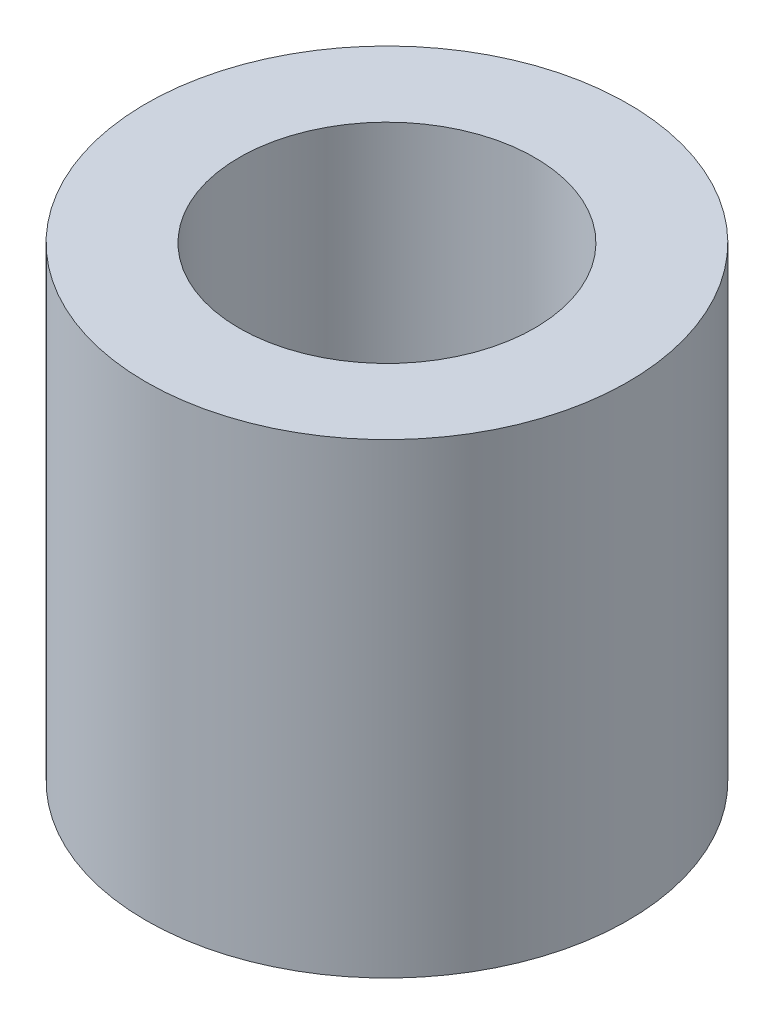
ISO-10303-21;
HEADER;
FILE_DESCRIPTION(('STEP AP214'),'2;1');
FILE_NAME('part.step','',(''),(''),'','','');
FILE_SCHEMA(('AUTOMOTIVE_DESIGN { 1 0 10303 214 1 1 1 1 }'));
ENDSEC;
DATA;
#1=APPLICATION_CONTEXT('core data for automotive mechanical design processes');
#2=APPLICATION_PROTOCOL_DEFINITION('international standard','automotive_design',2000,#1);
#3=PRODUCT_CONTEXT('',#1,'mechanical');
#4=PRODUCT('Part','Part','',(#3));
#5=PRODUCT_RELATED_PRODUCT_CATEGORY('part','',(#4));
#6=PRODUCT_DEFINITION_FORMATION('','',#4);
#7=PRODUCT_DEFINITION_CONTEXT('part definition',#1,'design');
#8=PRODUCT_DEFINITION('design','',#6,#7);
#9=PRODUCT_DEFINITION_SHAPE('','',#8);
#10=(LENGTH_UNIT() NAMED_UNIT(*) SI_UNIT(.MILLI.,.METRE.));
#11=(NAMED_UNIT(*) PLANE_ANGLE_UNIT() SI_UNIT($,.RADIAN.));
#12=(NAMED_UNIT(*) SI_UNIT($,.STERADIAN.) SOLID_ANGLE_UNIT());
#13=UNCERTAINTY_MEASURE_WITH_UNIT(LENGTH_MEASURE(1.E-05),#10,'distance_accuracy_value','');
#14=(GEOMETRIC_REPRESENTATION_CONTEXT(3) GLOBAL_UNCERTAINTY_ASSIGNED_CONTEXT((#13)) GLOBAL_UNIT_ASSIGNED_CONTEXT((#10,
#11,#12)) REPRESENTATION_CONTEXT('',''));
#15=CARTESIAN_POINT('',(0.,0.,0.));
#16=DIRECTION('',(0.,0.,1.));
#17=DIRECTION('',(1.,0.,0.));
#18=AXIS2_PLACEMENT_3D('',#15,#16,#17);
#19=CARTESIAN_POINT('',(0.,12.7,0.));
#20=DIRECTION('',(0.,1.,0.));
#21=DIRECTION('',(0.,0.,1.));
#22=AXIS2_PLACEMENT_3D('',#19,#20,#21);
#23=PLANE('',#22);
#24=CARTESIAN_POINT('',(0.,12.7,0.));
#25=DIRECTION('',(0.,1.,0.));
#26=DIRECTION('',(0.,0.,1.));
#27=AXIS2_PLACEMENT_3D('',#24,#25,#26);
#28=CIRCLE('',#27,6.565);
#29=CARTESIAN_POINT('',(0.,12.7,6.565));
#30=VERTEX_POINT('',#29);
#31=EDGE_CURVE('E10',#30,#30,#28,.T.);
#32=ORIENTED_EDGE('',*,*,#31,.T.);
#33=EDGE_LOOP('',(#32));
#34=FACE_BOUND('',#33,.T.);
#35=CARTESIAN_POINT('',(0.,12.7,0.));
#36=DIRECTION('',(0.,1.,0.));
#37=DIRECTION('',(0.,0.,1.));
#38=AXIS2_PLACEMENT_3D('',#35,#36,#37);
#39=CIRCLE('',#38,4.025);
#40=CARTESIAN_POINT('',(0.,12.7,4.025));
#41=VERTEX_POINT('',#40);
#42=EDGE_CURVE('E52',#41,#41,#39,.T.);
#43=ORIENTED_EDGE('',*,*,#42,.F.);
#44=EDGE_LOOP('',(#43));
#45=FACE_BOUND('',#44,.T.);
#46=ADVANCED_FACE('F41',(#34,#45),#23,.T.);
#47=CARTESIAN_POINT('',(0.,0.,0.));
#48=DIRECTION('',(0.,1.,0.));
#49=DIRECTION('',(0.,0.,1.));
#50=AXIS2_PLACEMENT_3D('',#47,#48,#49);
#51=PLANE('',#50);
#52=CARTESIAN_POINT('',(0.,0.,0.));
#53=DIRECTION('',(0.,1.,0.));
#54=DIRECTION('',(0.,0.,1.));
#55=AXIS2_PLACEMENT_3D('',#52,#53,#54);
#56=CIRCLE('',#55,6.565);
#57=CARTESIAN_POINT('',(0.,0.,6.565));
#58=VERTEX_POINT('',#57);
#59=EDGE_CURVE('E45',#58,#58,#56,.T.);
#60=ORIENTED_EDGE('',*,*,#59,.F.);
#61=EDGE_LOOP('',(#60));
#62=FACE_BOUND('',#61,.T.);
#63=CARTESIAN_POINT('',(0.,0.,0.));
#64=DIRECTION('',(0.,1.,0.));
#65=DIRECTION('',(0.,0.,1.));
#66=AXIS2_PLACEMENT_3D('',#63,#64,#65);
#67=CIRCLE('',#66,4.025);
#68=CARTESIAN_POINT('',(0.,0.,4.025));
#69=VERTEX_POINT('',#68);
#70=EDGE_CURVE('E54',#69,#69,#67,.T.);
#71=ORIENTED_EDGE('',*,*,#70,.T.);
#72=EDGE_LOOP('',(#71));
#73=FACE_BOUND('',#72,.T.);
#74=ADVANCED_FACE('F64',(#62,#73),#51,.F.);
#75=CARTESIAN_POINT('',(0.,12.7,0.));
#76=DIRECTION('',(0.,-1.,0.));
#77=DIRECTION('',(0.,0.,-1.));
#78=AXIS2_PLACEMENT_3D('',#75,#76,#77);
#79=CYLINDRICAL_SURFACE('',#78,6.565);
#80=ORIENTED_EDGE('',*,*,#31,.F.);
#81=EDGE_LOOP('',(#80));
#82=FACE_BOUND('',#81,.T.);
#83=ORIENTED_EDGE('',*,*,#59,.T.);
#84=EDGE_LOOP('',(#83));
#85=FACE_BOUND('',#84,.T.);
#86=ADVANCED_FACE('F43',(#82,#85),#79,.T.);
#87=CARTESIAN_POINT('',(0.,12.7,0.));
#88=DIRECTION('',(0.,-1.,0.));
#89=DIRECTION('',(0.,0.,-1.));
#90=AXIS2_PLACEMENT_3D('',#87,#88,#89);
#91=CYLINDRICAL_SURFACE('',#90,4.025);
#92=ORIENTED_EDGE('',*,*,#42,.T.);
#93=EDGE_LOOP('',(#92));
#94=FACE_BOUND('',#93,.T.);
#95=ORIENTED_EDGE('',*,*,#70,.F.);
#96=EDGE_LOOP('',(#95));
#97=FACE_BOUND('',#96,.T.);
#98=ADVANCED_FACE('F60',(#94,#97),#91,.F.);
#99=CLOSED_SHELL('',(#46,#74,#86,#98));
#100=MANIFOLD_SOLID_BREP('B2',#99);
#101=ADVANCED_BREP_SHAPE_REPRESENTATION('',(#18,#100),#14);
#102=SHAPE_DEFINITION_REPRESENTATION(#9,#101);
ENDSEC;
END-ISO-10303-21;
